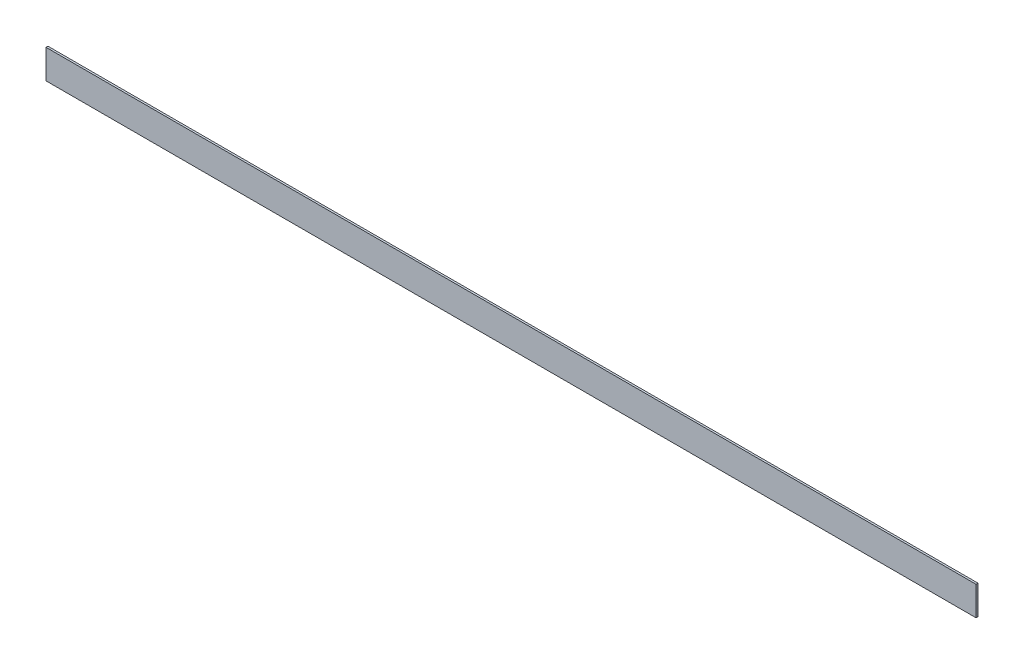
ISO-10303-21;
HEADER;
FILE_DESCRIPTION(('STEP AP214'),'2;1');
FILE_NAME('part.step','',(''),(''),'','','');
FILE_SCHEMA(('AUTOMOTIVE_DESIGN { 1 0 10303 214 1 1 1 1 }'));
ENDSEC;
DATA;
#1=APPLICATION_CONTEXT('core data for automotive mechanical design processes');
#2=APPLICATION_PROTOCOL_DEFINITION('international standard','automotive_design',2000,#1);
#3=PRODUCT_CONTEXT('',#1,'mechanical');
#4=PRODUCT('Part','Part','',(#3));
#5=PRODUCT_RELATED_PRODUCT_CATEGORY('part','',(#4));
#6=PRODUCT_DEFINITION_FORMATION('','',#4);
#7=PRODUCT_DEFINITION_CONTEXT('part definition',#1,'design');
#8=PRODUCT_DEFINITION('design','',#6,#7);
#9=PRODUCT_DEFINITION_SHAPE('','',#8);
#10=(LENGTH_UNIT() NAMED_UNIT(*) SI_UNIT(.MILLI.,.METRE.));
#11=(NAMED_UNIT(*) PLANE_ANGLE_UNIT() SI_UNIT($,.RADIAN.));
#12=(NAMED_UNIT(*) SI_UNIT($,.STERADIAN.) SOLID_ANGLE_UNIT());
#13=UNCERTAINTY_MEASURE_WITH_UNIT(LENGTH_MEASURE(1.E-05),#10,'distance_accuracy_value','');
#14=(GEOMETRIC_REPRESENTATION_CONTEXT(3) GLOBAL_UNCERTAINTY_ASSIGNED_CONTEXT((#13)) GLOBAL_UNIT_ASSIGNED_CONTEXT((#10,
#11,#12)) REPRESENTATION_CONTEXT('',''));
#15=CARTESIAN_POINT('',(0.,0.,0.));
#16=DIRECTION('',(0.,0.,1.));
#17=DIRECTION('',(1.,0.,0.));
#18=AXIS2_PLACEMENT_3D('',#15,#16,#17);
#19=CARTESIAN_POINT('',(0.,0.,1.27));
#20=DIRECTION('',(1.,0.,0.));
#21=DIRECTION('',(0.,0.,-1.));
#22=AXIS2_PLACEMENT_3D('',#19,#20,#21);
#23=PLANE('',#22);
#24=DIRECTION('',(0.,-1.,0.));
#25=VECTOR('',#24,1.);
#26=CARTESIAN_POINT('',(0.,0.,0.));
#27=LINE('',#26,#25);
#28=CARTESIAN_POINT('',(0.,19.05,0.));
#29=VERTEX_POINT('',#28);
#30=CARTESIAN_POINT('',(0.,0.,0.));
#31=VERTEX_POINT('',#30);
#32=EDGE_CURVE('E107',#29,#31,#27,.T.);
#33=ORIENTED_EDGE('',*,*,#32,.T.);
#34=DIRECTION('',(0.,0.,-1.));
#35=VECTOR('',#34,1.);
#36=CARTESIAN_POINT('',(0.,0.,1.27));
#37=LINE('',#36,#35);
#38=CARTESIAN_POINT('',(0.,0.,1.27));
#39=VERTEX_POINT('',#38);
#40=EDGE_CURVE('E11',#39,#31,#37,.T.);
#41=ORIENTED_EDGE('',*,*,#40,.F.);
#42=DIRECTION('',(0.,-1.,0.));
#43=VECTOR('',#42,1.);
#44=CARTESIAN_POINT('',(0.,0.,1.27));
#45=LINE('',#44,#43);
#46=CARTESIAN_POINT('',(0.,19.05,1.27));
#47=VERTEX_POINT('',#46);
#48=EDGE_CURVE('E91',#47,#39,#45,.T.);
#49=ORIENTED_EDGE('',*,*,#48,.F.);
#50=DIRECTION('',(0.,0.,-1.));
#51=VECTOR('',#50,1.);
#52=CARTESIAN_POINT('',(0.,19.05,1.27));
#53=LINE('',#52,#51);
#54=EDGE_CURVE('E103',#47,#29,#53,.T.);
#55=ORIENTED_EDGE('',*,*,#54,.T.);
#56=EDGE_LOOP('',(#33,#41,#49,#55));
#57=FACE_BOUND('',#56,.T.);
#58=ADVANCED_FACE('F39',(#57),#23,.F.);
#59=CARTESIAN_POINT('',(0.,0.,1.27));
#60=DIRECTION('',(0.,1.,0.));
#61=DIRECTION('',(0.,0.,1.));
#62=AXIS2_PLACEMENT_3D('',#59,#60,#61);
#63=PLANE('',#62);
#64=DIRECTION('',(1.,0.,0.));
#65=VECTOR('',#64,1.);
#66=CARTESIAN_POINT('',(0.,0.,0.));
#67=LINE('',#66,#65);
#68=CARTESIAN_POINT('',(609.6,0.,0.));
#69=VERTEX_POINT('',#68);
#70=EDGE_CURVE('E96',#31,#69,#67,.T.);
#71=ORIENTED_EDGE('',*,*,#70,.T.);
#72=DIRECTION('',(0.,0.,-1.));
#73=VECTOR('',#72,1.);
#74=CARTESIAN_POINT('',(609.6,0.,1.27));
#75=LINE('',#74,#73);
#76=CARTESIAN_POINT('',(609.6,0.,1.27));
#77=VERTEX_POINT('',#76);
#78=EDGE_CURVE('E48',#77,#69,#75,.T.);
#79=ORIENTED_EDGE('',*,*,#78,.F.);
#80=DIRECTION('',(1.,0.,0.));
#81=VECTOR('',#80,1.);
#82=CARTESIAN_POINT('',(0.,0.,1.27));
#83=LINE('',#82,#81);
#84=EDGE_CURVE('E86',#39,#77,#83,.T.);
#85=ORIENTED_EDGE('',*,*,#84,.F.);
#86=ORIENTED_EDGE('',*,*,#40,.T.);
#87=EDGE_LOOP('',(#71,#79,#85,#86));
#88=FACE_BOUND('',#87,.T.);
#89=ADVANCED_FACE('F95',(#88),#63,.F.);
#90=CARTESIAN_POINT('',(609.6,0.,1.27));
#91=DIRECTION('',(-1.,0.,0.));
#92=DIRECTION('',(0.,0.,1.));
#93=AXIS2_PLACEMENT_3D('',#90,#91,#92);
#94=PLANE('',#93);
#95=DIRECTION('',(0.,1.,0.));
#96=VECTOR('',#95,1.);
#97=CARTESIAN_POINT('',(609.6,0.,0.));
#98=LINE('',#97,#96);
#99=CARTESIAN_POINT('',(609.6,19.05,0.));
#100=VERTEX_POINT('',#99);
#101=EDGE_CURVE('E73',#69,#100,#98,.T.);
#102=ORIENTED_EDGE('',*,*,#101,.T.);
#103=DIRECTION('',(0.,0.,-1.));
#104=VECTOR('',#103,1.);
#105=CARTESIAN_POINT('',(609.6,19.05,1.27));
#106=LINE('',#105,#104);
#107=CARTESIAN_POINT('',(609.6,19.05,1.27));
#108=VERTEX_POINT('',#107);
#109=EDGE_CURVE('E98',#108,#100,#106,.T.);
#110=ORIENTED_EDGE('',*,*,#109,.F.);
#111=DIRECTION('',(0.,1.,0.));
#112=VECTOR('',#111,1.);
#113=CARTESIAN_POINT('',(609.6,0.,1.27));
#114=LINE('',#113,#112);
#115=EDGE_CURVE('E89',#77,#108,#114,.T.);
#116=ORIENTED_EDGE('',*,*,#115,.F.);
#117=ORIENTED_EDGE('',*,*,#78,.T.);
#118=EDGE_LOOP('',(#102,#110,#116,#117));
#119=FACE_BOUND('',#118,.T.);
#120=ADVANCED_FACE('F99',(#119),#94,.F.);
#121=CARTESIAN_POINT('',(0.,19.05,1.27));
#122=DIRECTION('',(0.,-1.,0.));
#123=DIRECTION('',(0.,0.,-1.));
#124=AXIS2_PLACEMENT_3D('',#121,#122,#123);
#125=PLANE('',#124);
#126=DIRECTION('',(-1.,0.,0.));
#127=VECTOR('',#126,1.);
#128=CARTESIAN_POINT('',(0.,19.05,0.));
#129=LINE('',#128,#127);
#130=EDGE_CURVE('E79',#100,#29,#129,.T.);
#131=ORIENTED_EDGE('',*,*,#130,.T.);
#132=ORIENTED_EDGE('',*,*,#54,.F.);
#133=DIRECTION('',(-1.,0.,0.));
#134=VECTOR('',#133,1.);
#135=CARTESIAN_POINT('',(0.,19.05,1.27));
#136=LINE('',#135,#134);
#137=EDGE_CURVE('E56',#108,#47,#136,.T.);
#138=ORIENTED_EDGE('',*,*,#137,.F.);
#139=ORIENTED_EDGE('',*,*,#109,.T.);
#140=EDGE_LOOP('',(#131,#132,#138,#139));
#141=FACE_BOUND('',#140,.T.);
#142=ADVANCED_FACE('F120',(#141),#125,.F.);
#143=CARTESIAN_POINT('',(0.,0.,1.27));
#144=DIRECTION('',(0.,0.,-1.));
#145=DIRECTION('',(-1.,0.,0.));
#146=AXIS2_PLACEMENT_3D('',#143,#144,#145);
#147=PLANE('',#146);
#148=ORIENTED_EDGE('',*,*,#48,.T.);
#149=ORIENTED_EDGE('',*,*,#84,.T.);
#150=ORIENTED_EDGE('',*,*,#115,.T.);
#151=ORIENTED_EDGE('',*,*,#137,.T.);
#152=EDGE_LOOP('',(#148,#149,#150,#151));
#153=FACE_BOUND('',#152,.T.);
#154=ADVANCED_FACE('F87',(#153),#147,.F.);
#155=CARTESIAN_POINT('',(0.,0.,0.));
#156=DIRECTION('',(0.,0.,-1.));
#157=DIRECTION('',(-1.,0.,0.));
#158=AXIS2_PLACEMENT_3D('',#155,#156,#157);
#159=PLANE('',#158);
#160=ORIENTED_EDGE('',*,*,#32,.F.);
#161=ORIENTED_EDGE('',*,*,#130,.F.);
#162=ORIENTED_EDGE('',*,*,#101,.F.);
#163=ORIENTED_EDGE('',*,*,#70,.F.);
#164=EDGE_LOOP('',(#160,#161,#162,#163));
#165=FACE_BOUND('',#164,.T.);
#166=ADVANCED_FACE('F123',(#165),#159,.T.);
#167=CLOSED_SHELL('',(#58,#89,#120,#142,#154,#166));
#168=MANIFOLD_SOLID_BREP('B2',#167);
#169=ADVANCED_BREP_SHAPE_REPRESENTATION('',(#18,#168),#14);
#170=SHAPE_DEFINITION_REPRESENTATION(#9,#169);
ENDSEC;
END-ISO-10303-21;
